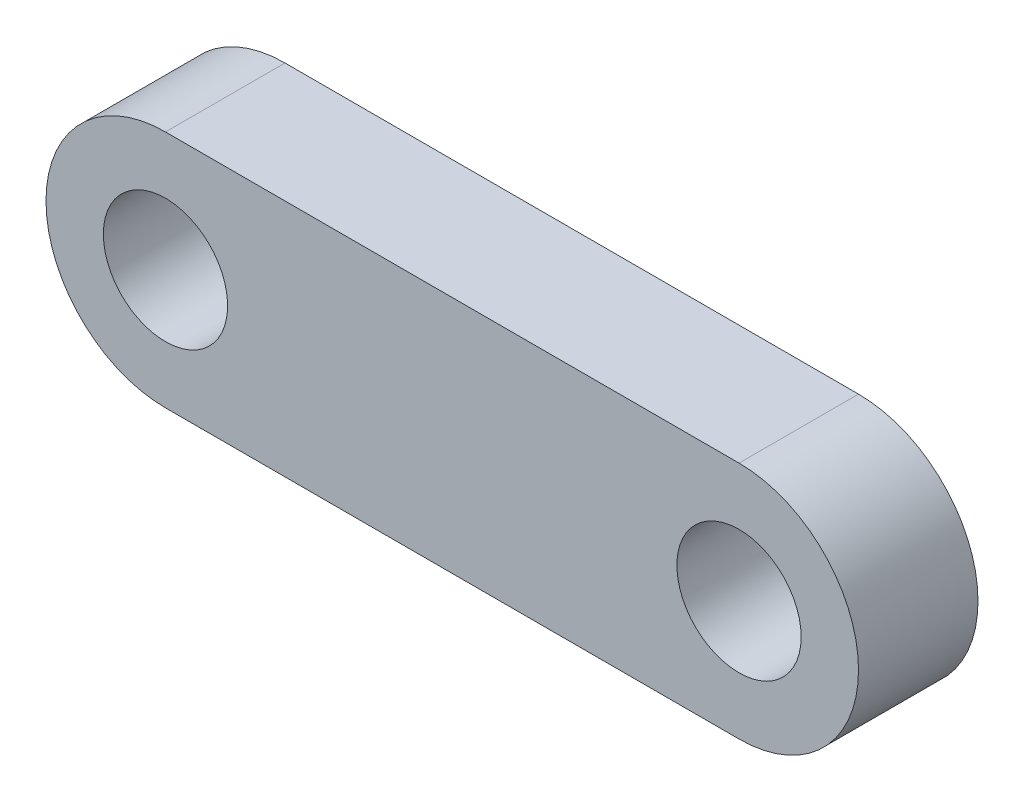
ISO-10303-21;
HEADER;
FILE_DESCRIPTION(('STEP AP214'),'2;1');
FILE_NAME('part.step','',(''),(''),'','','');
FILE_SCHEMA(('AUTOMOTIVE_DESIGN { 1 0 10303 214 1 1 1 1 }'));
ENDSEC;
DATA;
#1=APPLICATION_CONTEXT('core data for automotive mechanical design processes');
#2=APPLICATION_PROTOCOL_DEFINITION('international standard','automotive_design',2000,#1);
#3=PRODUCT_CONTEXT('',#1,'mechanical');
#4=PRODUCT('Part','Part','',(#3));
#5=PRODUCT_RELATED_PRODUCT_CATEGORY('part','',(#4));
#6=PRODUCT_DEFINITION_FORMATION('','',#4);
#7=PRODUCT_DEFINITION_CONTEXT('part definition',#1,'design');
#8=PRODUCT_DEFINITION('design','',#6,#7);
#9=PRODUCT_DEFINITION_SHAPE('','',#8);
#10=(LENGTH_UNIT() NAMED_UNIT(*) SI_UNIT(.MILLI.,.METRE.));
#11=(NAMED_UNIT(*) PLANE_ANGLE_UNIT() SI_UNIT($,.RADIAN.));
#12=(NAMED_UNIT(*) SI_UNIT($,.STERADIAN.) SOLID_ANGLE_UNIT());
#13=UNCERTAINTY_MEASURE_WITH_UNIT(LENGTH_MEASURE(1.E-05),#10,'distance_accuracy_value','');
#14=(GEOMETRIC_REPRESENTATION_CONTEXT(3) GLOBAL_UNCERTAINTY_ASSIGNED_CONTEXT((#13)) GLOBAL_UNIT_ASSIGNED_CONTEXT((#10,
#11,#12)) REPRESENTATION_CONTEXT('',''));
#15=CARTESIAN_POINT('',(0.,0.,0.));
#16=DIRECTION('',(0.,0.,1.));
#17=DIRECTION('',(1.,0.,0.));
#18=AXIS2_PLACEMENT_3D('',#15,#16,#17);
#19=CARTESIAN_POINT('',(-71.1788966961585,0.,3.175));
#20=DIRECTION('',(0.,0.,1.));
#21=DIRECTION('',(1.,0.,0.));
#22=AXIS2_PLACEMENT_3D('',#19,#20,#21);
#23=PLANE('',#22);
#24=CARTESIAN_POINT('',(-55.9388966961586,0.,3.175));
#25=DIRECTION('',(0.,0.,1.));
#26=DIRECTION('',(1.,0.,0.));
#27=AXIS2_PLACEMENT_3D('',#24,#25,#26);
#28=CIRCLE('',#27,1.651);
#29=CARTESIAN_POINT('',(-54.2878966961585,0.,3.175));
#30=VERTEX_POINT('',#29);
#31=EDGE_CURVE('E99',#30,#30,#28,.T.);
#32=ORIENTED_EDGE('',*,*,#31,.F.);
#33=EDGE_LOOP('',(#32));
#34=FACE_BOUND('',#33,.T.);
#35=CARTESIAN_POINT('',(-71.1788966961585,0.,3.175));
#36=DIRECTION('',(0.,0.,1.));
#37=DIRECTION('',(1.,0.,0.));
#38=AXIS2_PLACEMENT_3D('',#35,#36,#37);
#39=CIRCLE('',#38,3.175);
#40=CARTESIAN_POINT('',(-71.1788966961585,3.17499999999999,3.175));
#41=VERTEX_POINT('',#40);
#42=CARTESIAN_POINT('',(-71.1788966961585,-3.17500000000001,3.175));
#43=VERTEX_POINT('',#42);
#44=EDGE_CURVE('E84',#41,#43,#39,.T.);
#45=ORIENTED_EDGE('',*,*,#44,.T.);
#46=DIRECTION('',(1.,0.,0.));
#47=VECTOR('',#46,1.);
#48=CARTESIAN_POINT('',(-71.1788966961585,-3.17500000000001,3.175));
#49=LINE('',#48,#47);
#50=CARTESIAN_POINT('',(-55.9388966961586,-3.17500000000001,3.175));
#51=VERTEX_POINT('',#50);
#52=EDGE_CURVE('E79',#43,#51,#49,.T.);
#53=ORIENTED_EDGE('',*,*,#52,.T.);
#54=CARTESIAN_POINT('',(-55.9388966961586,0.,3.175));
#55=DIRECTION('',(0.,0.,1.));
#56=DIRECTION('',(-1.,0.,0.));
#57=AXIS2_PLACEMENT_3D('',#54,#55,#56);
#58=CIRCLE('',#57,3.175);
#59=CARTESIAN_POINT('',(-55.9388966961586,3.17499999999999,3.175));
#60=VERTEX_POINT('',#59);
#61=EDGE_CURVE('E82',#51,#60,#58,.T.);
#62=ORIENTED_EDGE('',*,*,#61,.T.);
#63=DIRECTION('',(-1.,0.,0.));
#64=VECTOR('',#63,1.);
#65=CARTESIAN_POINT('',(-71.1788966961585,3.17499999999999,3.175));
#66=LINE('',#65,#64);
#67=EDGE_CURVE('E49',#60,#41,#66,.T.);
#68=ORIENTED_EDGE('',*,*,#67,.T.);
#69=EDGE_LOOP('',(#45,#53,#62,#68));
#70=FACE_BOUND('',#69,.T.);
#71=CARTESIAN_POINT('',(-71.1788966961585,0.,3.175));
#72=DIRECTION('',(0.,0.,1.));
#73=DIRECTION('',(-1.,0.,0.));
#74=AXIS2_PLACEMENT_3D('',#71,#72,#73);
#75=CIRCLE('',#74,1.65099999999999);
#76=CARTESIAN_POINT('',(-72.8298966961585,0.,3.175));
#77=VERTEX_POINT('',#76);
#78=EDGE_CURVE('E114',#77,#77,#75,.T.);
#79=ORIENTED_EDGE('',*,*,#78,.F.);
#80=EDGE_LOOP('',(#79));
#81=FACE_BOUND('',#80,.T.);
#82=ADVANCED_FACE('F32',(#34,#70,#81),#23,.T.);
#83=CARTESIAN_POINT('',(-71.1788966961585,0.,0.));
#84=DIRECTION('',(0.,0.,1.));
#85=DIRECTION('',(1.,0.,0.));
#86=AXIS2_PLACEMENT_3D('',#83,#84,#85);
#87=PLANE('',#86);
#88=CARTESIAN_POINT('',(-55.9388966961586,0.,0.));
#89=DIRECTION('',(0.,0.,1.));
#90=DIRECTION('',(1.,0.,0.));
#91=AXIS2_PLACEMENT_3D('',#88,#89,#90);
#92=CIRCLE('',#91,1.651);
#93=CARTESIAN_POINT('',(-54.2878966961585,0.,0.));
#94=VERTEX_POINT('',#93);
#95=EDGE_CURVE('E111',#94,#94,#92,.T.);
#96=ORIENTED_EDGE('',*,*,#95,.T.);
#97=EDGE_LOOP('',(#96));
#98=FACE_BOUND('',#97,.T.);
#99=CARTESIAN_POINT('',(-71.1788966961585,0.,0.));
#100=DIRECTION('',(0.,0.,1.));
#101=DIRECTION('',(1.,0.,0.));
#102=AXIS2_PLACEMENT_3D('',#99,#100,#101);
#103=CIRCLE('',#102,3.175);
#104=CARTESIAN_POINT('',(-71.1788966961585,3.17499999999999,0.));
#105=VERTEX_POINT('',#104);
#106=CARTESIAN_POINT('',(-71.1788966961585,-3.17500000000001,0.));
#107=VERTEX_POINT('',#106);
#108=EDGE_CURVE('E96',#105,#107,#103,.T.);
#109=ORIENTED_EDGE('',*,*,#108,.F.);
#110=DIRECTION('',(-1.,0.,0.));
#111=VECTOR('',#110,1.);
#112=CARTESIAN_POINT('',(-71.1788966961585,3.17499999999999,0.));
#113=LINE('',#112,#111);
#114=CARTESIAN_POINT('',(-55.9388966961586,3.17499999999999,0.));
#115=VERTEX_POINT('',#114);
#116=EDGE_CURVE('E72',#115,#105,#113,.T.);
#117=ORIENTED_EDGE('',*,*,#116,.F.);
#118=CARTESIAN_POINT('',(-55.9388966961586,0.,0.));
#119=DIRECTION('',(0.,0.,1.));
#120=DIRECTION('',(-1.,0.,0.));
#121=AXIS2_PLACEMENT_3D('',#118,#119,#120);
#122=CIRCLE('',#121,3.175);
#123=CARTESIAN_POINT('',(-55.9388966961586,-3.17500000000001,0.));
#124=VERTEX_POINT('',#123);
#125=EDGE_CURVE('E66',#124,#115,#122,.T.);
#126=ORIENTED_EDGE('',*,*,#125,.F.);
#127=DIRECTION('',(1.,0.,0.));
#128=VECTOR('',#127,1.);
#129=CARTESIAN_POINT('',(-71.1788966961585,-3.17500000000001,0.));
#130=LINE('',#129,#128);
#131=EDGE_CURVE('E88',#107,#124,#130,.T.);
#132=ORIENTED_EDGE('',*,*,#131,.F.);
#133=EDGE_LOOP('',(#109,#117,#126,#132));
#134=FACE_BOUND('',#133,.T.);
#135=CARTESIAN_POINT('',(-71.1788966961585,0.,0.));
#136=DIRECTION('',(0.,0.,1.));
#137=DIRECTION('',(-1.,0.,0.));
#138=AXIS2_PLACEMENT_3D('',#135,#136,#137);
#139=CIRCLE('',#138,1.65099999999999);
#140=CARTESIAN_POINT('',(-72.8298966961585,0.,0.));
#141=VERTEX_POINT('',#140);
#142=EDGE_CURVE('E117',#141,#141,#139,.T.);
#143=ORIENTED_EDGE('',*,*,#142,.T.);
#144=EDGE_LOOP('',(#143));
#145=FACE_BOUND('',#144,.T.);
#146=ADVANCED_FACE('F107',(#98,#134,#145),#87,.F.);
#147=CARTESIAN_POINT('',(-71.1788966961585,0.,3.175));
#148=DIRECTION('',(0.,0.,-1.));
#149=DIRECTION('',(-1.,0.,0.));
#150=AXIS2_PLACEMENT_3D('',#147,#148,#149);
#151=CYLINDRICAL_SURFACE('',#150,3.175);
#152=ORIENTED_EDGE('',*,*,#108,.T.);
#153=DIRECTION('',(0.,0.,-1.));
#154=VECTOR('',#153,1.);
#155=CARTESIAN_POINT('',(-71.1788966961585,-3.17500000000001,3.175));
#156=LINE('',#155,#154);
#157=EDGE_CURVE('E11',#43,#107,#156,.T.);
#158=ORIENTED_EDGE('',*,*,#157,.F.);
#159=ORIENTED_EDGE('',*,*,#44,.F.);
#160=DIRECTION('',(0.,0.,-1.));
#161=VECTOR('',#160,1.);
#162=CARTESIAN_POINT('',(-71.1788966961585,3.17499999999999,3.175));
#163=LINE('',#162,#161);
#164=EDGE_CURVE('E92',#41,#105,#163,.T.);
#165=ORIENTED_EDGE('',*,*,#164,.T.);
#166=EDGE_LOOP('',(#152,#158,#159,#165));
#167=FACE_BOUND('',#166,.T.);
#168=ADVANCED_FACE('F34',(#167),#151,.T.);
#169=CARTESIAN_POINT('',(-71.1788966961585,-3.17500000000001,3.175));
#170=DIRECTION('',(0.,1.,0.));
#171=DIRECTION('',(-1.,0.,0.));
#172=AXIS2_PLACEMENT_3D('',#169,#170,#171);
#173=PLANE('',#172);
#174=ORIENTED_EDGE('',*,*,#131,.T.);
#175=DIRECTION('',(0.,0.,-1.));
#176=VECTOR('',#175,1.);
#177=CARTESIAN_POINT('',(-55.9388966961586,-3.17500000000001,3.175));
#178=LINE('',#177,#176);
#179=EDGE_CURVE('E41',#51,#124,#178,.T.);
#180=ORIENTED_EDGE('',*,*,#179,.F.);
#181=ORIENTED_EDGE('',*,*,#52,.F.);
#182=ORIENTED_EDGE('',*,*,#157,.T.);
#183=EDGE_LOOP('',(#174,#180,#181,#182));
#184=FACE_BOUND('',#183,.T.);
#185=ADVANCED_FACE('F87',(#184),#173,.F.);
#186=CARTESIAN_POINT('',(-55.9388966961586,0.,3.175));
#187=DIRECTION('',(0.,0.,-1.));
#188=DIRECTION('',(-1.,0.,0.));
#189=AXIS2_PLACEMENT_3D('',#186,#187,#188);
#190=CYLINDRICAL_SURFACE('',#189,3.175);
#191=ORIENTED_EDGE('',*,*,#125,.T.);
#192=DIRECTION('',(0.,0.,-1.));
#193=VECTOR('',#192,1.);
#194=CARTESIAN_POINT('',(-55.9388966961586,3.17499999999999,3.175));
#195=LINE('',#194,#193);
#196=EDGE_CURVE('E89',#60,#115,#195,.T.);
#197=ORIENTED_EDGE('',*,*,#196,.F.);
#198=ORIENTED_EDGE('',*,*,#61,.F.);
#199=ORIENTED_EDGE('',*,*,#179,.T.);
#200=EDGE_LOOP('',(#191,#197,#198,#199));
#201=FACE_BOUND('',#200,.T.);
#202=ADVANCED_FACE('F90',(#201),#190,.T.);
#203=CARTESIAN_POINT('',(-71.1788966961585,3.17499999999999,3.175));
#204=DIRECTION('',(0.,-1.,0.));
#205=DIRECTION('',(1.,0.,0.));
#206=AXIS2_PLACEMENT_3D('',#203,#204,#205);
#207=PLANE('',#206);
#208=ORIENTED_EDGE('',*,*,#116,.T.);
#209=ORIENTED_EDGE('',*,*,#164,.F.);
#210=ORIENTED_EDGE('',*,*,#67,.F.);
#211=ORIENTED_EDGE('',*,*,#196,.T.);
#212=EDGE_LOOP('',(#208,#209,#210,#211));
#213=FACE_BOUND('',#212,.T.);
#214=ADVANCED_FACE('F104',(#213),#207,.F.);
#215=CARTESIAN_POINT('',(-55.9388966961586,0.,3.175));
#216=DIRECTION('',(0.,0.,-1.));
#217=DIRECTION('',(-1.,0.,0.));
#218=AXIS2_PLACEMENT_3D('',#215,#216,#217);
#219=CYLINDRICAL_SURFACE('',#218,1.651);
#220=ORIENTED_EDGE('',*,*,#31,.T.);
#221=EDGE_LOOP('',(#220));
#222=FACE_BOUND('',#221,.T.);
#223=ORIENTED_EDGE('',*,*,#95,.F.);
#224=EDGE_LOOP('',(#223));
#225=FACE_BOUND('',#224,.T.);
#226=ADVANCED_FACE('F135',(#222,#225),#219,.F.);
#227=CARTESIAN_POINT('',(-71.1788966961585,0.,3.175));
#228=DIRECTION('',(0.,0.,-1.));
#229=DIRECTION('',(-1.,0.,0.));
#230=AXIS2_PLACEMENT_3D('',#227,#228,#229);
#231=CYLINDRICAL_SURFACE('',#230,1.65099999999999);
#232=ORIENTED_EDGE('',*,*,#78,.T.);
#233=EDGE_LOOP('',(#232));
#234=FACE_BOUND('',#233,.T.);
#235=ORIENTED_EDGE('',*,*,#142,.F.);
#236=EDGE_LOOP('',(#235));
#237=FACE_BOUND('',#236,.T.);
#238=ADVANCED_FACE('F123',(#234,#237),#231,.F.);
#239=CLOSED_SHELL('',(#82,#146,#168,#185,#202,#214,#226,#238));
#240=MANIFOLD_SOLID_BREP('B2',#239);
#241=ADVANCED_BREP_SHAPE_REPRESENTATION('',(#18,#240),#14);
#242=SHAPE_DEFINITION_REPRESENTATION(#9,#241);
ENDSEC;
END-ISO-10303-21;
